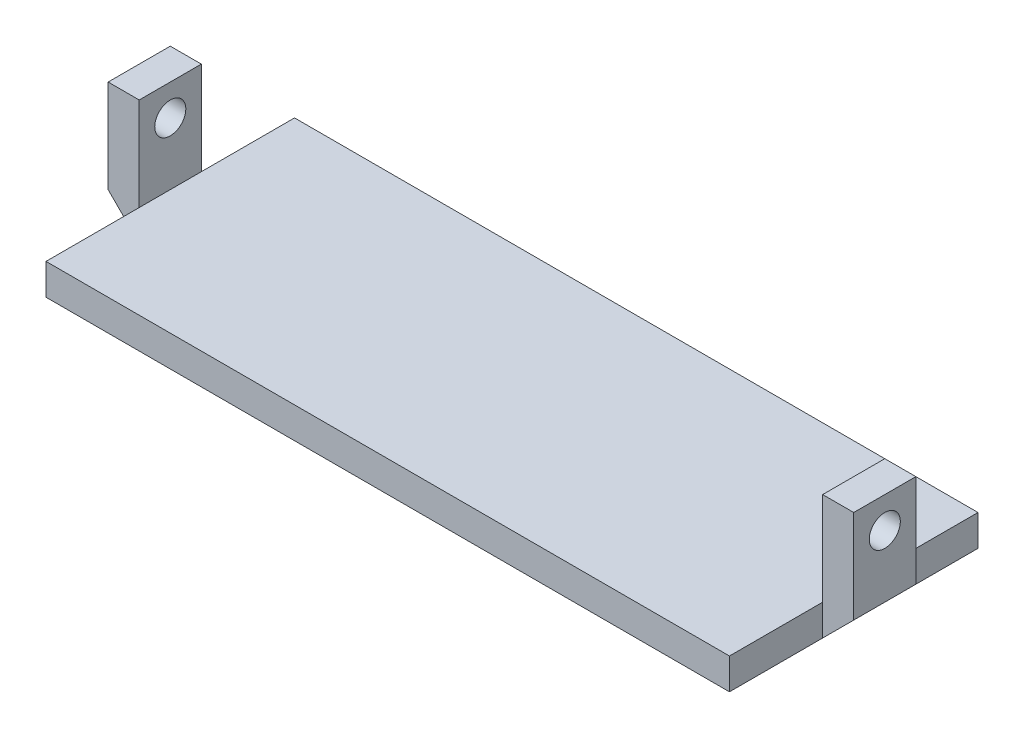
ISO-10303-21;
HEADER;
FILE_DESCRIPTION(('STEP AP214'),'2;1');
FILE_NAME('part.step','',(''),(''),'','','');
FILE_SCHEMA(('AUTOMOTIVE_DESIGN { 1 0 10303 214 1 1 1 1 }'));
ENDSEC;
DATA;
#1=APPLICATION_CONTEXT('core data for automotive mechanical design processes');
#2=APPLICATION_PROTOCOL_DEFINITION('international standard','automotive_design',2000,#1);
#3=PRODUCT_CONTEXT('',#1,'mechanical');
#4=PRODUCT('Part','Part','',(#3));
#5=PRODUCT_RELATED_PRODUCT_CATEGORY('part','',(#4));
#6=PRODUCT_DEFINITION_FORMATION('','',#4);
#7=PRODUCT_DEFINITION_CONTEXT('part definition',#1,'design');
#8=PRODUCT_DEFINITION('design','',#6,#7);
#9=PRODUCT_DEFINITION_SHAPE('','',#8);
#10=(LENGTH_UNIT() NAMED_UNIT(*) SI_UNIT(.MILLI.,.METRE.));
#11=(NAMED_UNIT(*) PLANE_ANGLE_UNIT() SI_UNIT($,.RADIAN.));
#12=(NAMED_UNIT(*) SI_UNIT($,.STERADIAN.) SOLID_ANGLE_UNIT());
#13=UNCERTAINTY_MEASURE_WITH_UNIT(LENGTH_MEASURE(1.E-05),#10,'distance_accuracy_value','');
#14=(GEOMETRIC_REPRESENTATION_CONTEXT(3) GLOBAL_UNCERTAINTY_ASSIGNED_CONTEXT((#13)) GLOBAL_UNIT_ASSIGNED_CONTEXT((#10,
#11,#12)) REPRESENTATION_CONTEXT('',''));
#15=CARTESIAN_POINT('',(0.,0.,0.));
#16=DIRECTION('',(0.,0.,1.));
#17=DIRECTION('',(1.,0.,0.));
#18=AXIS2_PLACEMENT_3D('',#15,#16,#17);
#19=CARTESIAN_POINT('',(0.,5.,0.));
#20=DIRECTION('',(0.,1.,0.));
#21=DIRECTION('',(0.,0.,1.));
#22=AXIS2_PLACEMENT_3D('',#19,#20,#21);
#23=PLANE('',#22);
#24=DIRECTION('',(0.,0.,-1.));
#25=VECTOR('',#24,1.);
#26=CARTESIAN_POINT('',(-55.,5.,17.5));
#27=LINE('',#26,#25);
#28=CARTESIAN_POINT('',(-55.,5.,32.5));
#29=VERTEX_POINT('',#28);
#30=CARTESIAN_POINT('',(-55.,5.,17.5));
#31=VERTEX_POINT('',#30);
#32=EDGE_CURVE('E313',#29,#31,#27,.T.);
#33=ORIENTED_EDGE('',*,*,#32,.F.);
#34=DIRECTION('',(1.,0.,0.));
#35=VECTOR('',#34,1.);
#36=CARTESIAN_POINT('',(0.,5.,32.5));
#37=LINE('',#36,#35);
#38=CARTESIAN_POINT('',(55.,5.,32.5));
#39=VERTEX_POINT('',#38);
#40=EDGE_CURVE('E63',#29,#39,#37,.T.);
#41=ORIENTED_EDGE('',*,*,#40,.T.);
#42=DIRECTION('',(0.,0.,1.));
#43=VECTOR('',#42,1.);
#44=CARTESIAN_POINT('',(55.,5.,17.5));
#45=LINE('',#44,#43);
#46=CARTESIAN_POINT('',(55.,5.,17.5));
#47=VERTEX_POINT('',#46);
#48=EDGE_CURVE('E164',#47,#39,#45,.T.);
#49=ORIENTED_EDGE('',*,*,#48,.F.);
#50=DIRECTION('',(0.,0.,1.));
#51=VECTOR('',#50,1.);
#52=CARTESIAN_POINT('',(55.,5.,7.49999999999998));
#53=LINE('',#52,#51);
#54=CARTESIAN_POINT('',(55.,5.,7.49999999999999));
#55=VERTEX_POINT('',#54);
#56=EDGE_CURVE('E225',#55,#47,#53,.T.);
#57=ORIENTED_EDGE('',*,*,#56,.F.);
#58=DIRECTION('',(0.,0.,1.));
#59=VECTOR('',#58,1.);
#60=CARTESIAN_POINT('',(55.,5.,-7.50000000000001));
#61=LINE('',#60,#59);
#62=CARTESIAN_POINT('',(55.,5.,-7.50000000000001));
#63=VERTEX_POINT('',#62);
#64=EDGE_CURVE('E179',#63,#55,#61,.T.);
#65=ORIENTED_EDGE('',*,*,#64,.F.);
#66=DIRECTION('',(-1.,0.,0.));
#67=VECTOR('',#66,1.);
#68=CARTESIAN_POINT('',(0.,5.,-7.50000000000001));
#69=LINE('',#68,#67);
#70=CARTESIAN_POINT('',(-55.,5.,-7.50000000000001));
#71=VERTEX_POINT('',#70);
#72=EDGE_CURVE('E166',#63,#71,#69,.T.);
#73=ORIENTED_EDGE('',*,*,#72,.T.);
#74=DIRECTION('',(0.,0.,-1.));
#75=VECTOR('',#74,1.);
#76=CARTESIAN_POINT('',(-55.,5.,-7.50000000000001));
#77=LINE('',#76,#75);
#78=CARTESIAN_POINT('',(-55.,5.,7.49999999999999));
#79=VERTEX_POINT('',#78);
#80=EDGE_CURVE('E204',#79,#71,#77,.T.);
#81=ORIENTED_EDGE('',*,*,#80,.F.);
#82=DIRECTION('',(0.,0.,-1.));
#83=VECTOR('',#82,1.);
#84=CARTESIAN_POINT('',(-55.,5.,7.49999999999999));
#85=LINE('',#84,#83);
#86=EDGE_CURVE('E258',#31,#79,#85,.T.);
#87=ORIENTED_EDGE('',*,*,#86,.F.);
#88=EDGE_LOOP('',(#33,#41,#49,#57,#65,#73,#81,#87));
#89=FACE_BOUND('',#88,.T.);
#90=ADVANCED_FACE('F47',(#89),#23,.T.);
#91=CARTESIAN_POINT('',(0.,0.,0.));
#92=DIRECTION('',(0.,1.,0.));
#93=DIRECTION('',(0.,0.,1.));
#94=AXIS2_PLACEMENT_3D('',#91,#92,#93);
#95=PLANE('',#94);
#96=DIRECTION('',(-1.,0.,0.));
#97=VECTOR('',#96,1.);
#98=CARTESIAN_POINT('',(0.,0.,32.5));
#99=LINE('',#98,#97);
#100=CARTESIAN_POINT('',(55.,0.,32.5));
#101=VERTEX_POINT('',#100);
#102=CARTESIAN_POINT('',(-55.,0.,32.5));
#103=VERTEX_POINT('',#102);
#104=EDGE_CURVE('E148',#101,#103,#99,.T.);
#105=ORIENTED_EDGE('',*,*,#104,.T.);
#106=DIRECTION('',(0.,0.,-1.));
#107=VECTOR('',#106,1.);
#108=CARTESIAN_POINT('',(-55.,0.,17.5));
#109=LINE('',#108,#107);
#110=CARTESIAN_POINT('',(-55.,0.,17.5));
#111=VERTEX_POINT('',#110);
#112=EDGE_CURVE('E316',#103,#111,#109,.T.);
#113=ORIENTED_EDGE('',*,*,#112,.T.);
#114=DIRECTION('',(0.,0.,-1.));
#115=VECTOR('',#114,1.);
#116=CARTESIAN_POINT('',(-55.,0.,0.));
#117=LINE('',#116,#115);
#118=CARTESIAN_POINT('',(-55.,0.,7.49999999999999));
#119=VERTEX_POINT('',#118);
#120=EDGE_CURVE('E287',#111,#119,#117,.T.);
#121=ORIENTED_EDGE('',*,*,#120,.T.);
#122=DIRECTION('',(0.,0.,-1.));
#123=VECTOR('',#122,1.);
#124=CARTESIAN_POINT('',(-55.,0.,-7.50000000000001));
#125=LINE('',#124,#123);
#126=CARTESIAN_POINT('',(-55.,0.,-7.50000000000001));
#127=VERTEX_POINT('',#126);
#128=EDGE_CURVE('E303',#119,#127,#125,.T.);
#129=ORIENTED_EDGE('',*,*,#128,.T.);
#130=DIRECTION('',(1.,0.,0.));
#131=VECTOR('',#130,1.);
#132=CARTESIAN_POINT('',(0.,0.,-7.50000000000001));
#133=LINE('',#132,#131);
#134=CARTESIAN_POINT('',(55.,0.,-7.50000000000001));
#135=VERTEX_POINT('',#134);
#136=EDGE_CURVE('E156',#127,#135,#133,.T.);
#137=ORIENTED_EDGE('',*,*,#136,.T.);
#138=DIRECTION('',(0.,0.,1.));
#139=VECTOR('',#138,1.);
#140=CARTESIAN_POINT('',(55.,0.,-7.50000000000001));
#141=LINE('',#140,#139);
#142=CARTESIAN_POINT('',(55.,0.,7.49999999999999));
#143=VERTEX_POINT('',#142);
#144=EDGE_CURVE('E186',#135,#143,#141,.T.);
#145=ORIENTED_EDGE('',*,*,#144,.T.);
#146=DIRECTION('',(0.,0.,1.));
#147=VECTOR('',#146,1.);
#148=CARTESIAN_POINT('',(55.,0.,0.));
#149=LINE('',#148,#147);
#150=CARTESIAN_POINT('',(55.,0.,17.5));
#151=VERTEX_POINT('',#150);
#152=EDGE_CURVE('E171',#143,#151,#149,.T.);
#153=ORIENTED_EDGE('',*,*,#152,.T.);
#154=DIRECTION('',(0.,0.,1.));
#155=VECTOR('',#154,1.);
#156=CARTESIAN_POINT('',(55.,0.,17.5));
#157=LINE('',#156,#155);
#158=EDGE_CURVE('E162',#151,#101,#157,.T.);
#159=ORIENTED_EDGE('',*,*,#158,.T.);
#160=EDGE_LOOP('',(#105,#113,#121,#129,#137,#145,#153,#159));
#161=FACE_BOUND('',#160,.T.);
#162=ADVANCED_FACE('F168',(#161),#95,.F.);
#163=CARTESIAN_POINT('',(55.,0.,17.5));
#164=DIRECTION('',(-1.,0.,0.));
#165=DIRECTION('',(0.,0.,1.));
#166=AXIS2_PLACEMENT_3D('',#163,#164,#165);
#167=PLANE('',#166);
#168=DIRECTION('',(0.,-1.,0.));
#169=VECTOR('',#168,1.);
#170=CARTESIAN_POINT('',(55.,20.,32.5));
#171=LINE('',#170,#169);
#172=EDGE_CURVE('E151',#39,#101,#171,.T.);
#173=ORIENTED_EDGE('',*,*,#172,.T.);
#174=ORIENTED_EDGE('',*,*,#158,.F.);
#175=DIRECTION('',(0.,1.,0.));
#176=VECTOR('',#175,1.);
#177=CARTESIAN_POINT('',(55.,0.,17.5));
#178=LINE('',#177,#176);
#179=EDGE_CURVE('E173',#151,#47,#178,.T.);
#180=ORIENTED_EDGE('',*,*,#179,.T.);
#181=ORIENTED_EDGE('',*,*,#48,.T.);
#182=EDGE_LOOP('',(#173,#174,#180,#181));
#183=FACE_BOUND('',#182,.T.);
#184=ADVANCED_FACE('F161',(#183),#167,.F.);
#185=CARTESIAN_POINT('',(-55.,0.,17.5));
#186=DIRECTION('',(1.,0.,0.));
#187=DIRECTION('',(0.,0.,-1.));
#188=AXIS2_PLACEMENT_3D('',#185,#186,#187);
#189=PLANE('',#188);
#190=DIRECTION('',(0.,-1.,0.));
#191=VECTOR('',#190,1.);
#192=CARTESIAN_POINT('',(-55.,0.,32.5));
#193=LINE('',#192,#191);
#194=EDGE_CURVE('E11',#29,#103,#193,.T.);
#195=ORIENTED_EDGE('',*,*,#194,.F.);
#196=ORIENTED_EDGE('',*,*,#32,.T.);
#197=DIRECTION('',(0.,1.,0.));
#198=VECTOR('',#197,1.);
#199=CARTESIAN_POINT('',(-55.,0.,17.5));
#200=LINE('',#199,#198);
#201=EDGE_CURVE('E177',#111,#31,#200,.T.);
#202=ORIENTED_EDGE('',*,*,#201,.F.);
#203=ORIENTED_EDGE('',*,*,#112,.F.);
#204=EDGE_LOOP('',(#195,#196,#202,#203));
#205=FACE_BOUND('',#204,.T.);
#206=ADVANCED_FACE('F364',(#205),#189,.F.);
#207=CARTESIAN_POINT('',(60.,5.,-42.5));
#208=DIRECTION('',(-1.,0.,0.));
#209=DIRECTION('',(0.,0.,1.));
#210=AXIS2_PLACEMENT_3D('',#207,#208,#209);
#211=PLANE('',#210);
#212=CARTESIAN_POINT('',(60.,15.,12.5));
#213=DIRECTION('',(-1.,0.,0.));
#214=DIRECTION('',(0.,0.,1.));
#215=AXIS2_PLACEMENT_3D('',#212,#213,#214);
#216=CIRCLE('',#215,2.5);
#217=CARTESIAN_POINT('',(60.,15.,15.));
#218=VERTEX_POINT('',#217);
#219=EDGE_CURVE('E200',#218,#218,#216,.T.);
#220=ORIENTED_EDGE('',*,*,#219,.T.);
#221=EDGE_LOOP('',(#220));
#222=FACE_BOUND('',#221,.T.);
#223=DIRECTION('',(0.,-1.,0.));
#224=VECTOR('',#223,1.);
#225=CARTESIAN_POINT('',(60.,20.,17.5));
#226=LINE('',#225,#224);
#227=CARTESIAN_POINT('',(60.,20.,17.5));
#228=VERTEX_POINT('',#227);
#229=CARTESIAN_POINT('',(60.,5.,17.5));
#230=VERTEX_POINT('',#229);
#231=EDGE_CURVE('E217',#228,#230,#226,.T.);
#232=ORIENTED_EDGE('',*,*,#231,.T.);
#233=DIRECTION('',(0.,0.,-1.));
#234=VECTOR('',#233,1.);
#235=CARTESIAN_POINT('',(60.,5.,-42.5));
#236=LINE('',#235,#234);
#237=CARTESIAN_POINT('',(60.,5.,7.49999999999997));
#238=VERTEX_POINT('',#237);
#239=EDGE_CURVE('E293',#230,#238,#236,.T.);
#240=ORIENTED_EDGE('',*,*,#239,.T.);
#241=DIRECTION('',(0.,-1.,0.));
#242=VECTOR('',#241,1.);
#243=CARTESIAN_POINT('',(60.,20.,7.49999999999997));
#244=LINE('',#243,#242);
#245=CARTESIAN_POINT('',(60.,20.,7.49999999999997));
#246=VERTEX_POINT('',#245);
#247=EDGE_CURVE('E220',#246,#238,#244,.T.);
#248=ORIENTED_EDGE('',*,*,#247,.F.);
#249=DIRECTION('',(0.,0.,-1.));
#250=VECTOR('',#249,1.);
#251=CARTESIAN_POINT('',(60.,20.,7.49999999999997));
#252=LINE('',#251,#250);
#253=EDGE_CURVE('E224',#228,#246,#252,.T.);
#254=ORIENTED_EDGE('',*,*,#253,.F.);
#255=EDGE_LOOP('',(#232,#240,#248,#254));
#256=FACE_BOUND('',#255,.T.);
#257=ADVANCED_FACE('F350',(#222,#256),#211,.F.);
#258=CARTESIAN_POINT('',(-60.,5.,-42.5));
#259=DIRECTION('',(1.,0.,0.));
#260=DIRECTION('',(0.,0.,-1.));
#261=AXIS2_PLACEMENT_3D('',#258,#259,#260);
#262=PLANE('',#261);
#263=CARTESIAN_POINT('',(-60.,15.,12.5));
#264=DIRECTION('',(-1.,0.,0.));
#265=DIRECTION('',(0.,0.,1.));
#266=AXIS2_PLACEMENT_3D('',#263,#264,#265);
#267=CIRCLE('',#266,2.5);
#268=CARTESIAN_POINT('',(-60.,15.,15.));
#269=VERTEX_POINT('',#268);
#270=EDGE_CURVE('E195',#269,#269,#267,.T.);
#271=ORIENTED_EDGE('',*,*,#270,.F.);
#272=EDGE_LOOP('',(#271));
#273=FACE_BOUND('',#272,.T.);
#274=DIRECTION('',(0.,-1.,0.));
#275=VECTOR('',#274,1.);
#276=CARTESIAN_POINT('',(-60.,20.,7.49999999999999));
#277=LINE('',#276,#275);
#278=CARTESIAN_POINT('',(-60.,20.,7.49999999999999));
#279=VERTEX_POINT('',#278);
#280=CARTESIAN_POINT('',(-60.,4.99999999999999,7.49999999999999));
#281=VERTEX_POINT('',#280);
#282=EDGE_CURVE('E253',#279,#281,#277,.T.);
#283=ORIENTED_EDGE('',*,*,#282,.T.);
#284=DIRECTION('',(0.,0.,1.));
#285=VECTOR('',#284,1.);
#286=CARTESIAN_POINT('',(-60.,4.99999999999999,-42.5));
#287=LINE('',#286,#285);
#288=CARTESIAN_POINT('',(-60.,4.99999999999999,17.5));
#289=VERTEX_POINT('',#288);
#290=EDGE_CURVE('E262',#281,#289,#287,.T.);
#291=ORIENTED_EDGE('',*,*,#290,.T.);
#292=DIRECTION('',(0.,-1.,0.));
#293=VECTOR('',#292,1.);
#294=CARTESIAN_POINT('',(-60.,20.,17.5));
#295=LINE('',#294,#293);
#296=CARTESIAN_POINT('',(-60.,20.,17.5));
#297=VERTEX_POINT('',#296);
#298=EDGE_CURVE('E229',#297,#289,#295,.T.);
#299=ORIENTED_EDGE('',*,*,#298,.F.);
#300=DIRECTION('',(0.,0.,1.));
#301=VECTOR('',#300,1.);
#302=CARTESIAN_POINT('',(-60.,20.,7.49999999999999));
#303=LINE('',#302,#301);
#304=EDGE_CURVE('E263',#279,#297,#303,.T.);
#305=ORIENTED_EDGE('',*,*,#304,.F.);
#306=EDGE_LOOP('',(#283,#291,#299,#305));
#307=FACE_BOUND('',#306,.T.);
#308=ADVANCED_FACE('F374',(#273,#307),#262,.F.);
#309=CARTESIAN_POINT('',(-60.,20.,17.5));
#310=DIRECTION('',(0.,0.,-1.));
#311=DIRECTION('',(-1.,0.,0.));
#312=AXIS2_PLACEMENT_3D('',#309,#310,#311);
#313=PLANE('',#312);
#314=ORIENTED_EDGE('',*,*,#298,.T.);
#315=DIRECTION('',(-0.707106781186549,0.707106781186547,0.));
#316=VECTOR('',#315,1.);
#317=CARTESIAN_POINT('',(-60.,5.,17.5));
#318=LINE('',#317,#316);
#319=EDGE_CURVE('E281',#289,#111,#318,.F.);
#320=ORIENTED_EDGE('',*,*,#319,.T.);
#321=ORIENTED_EDGE('',*,*,#201,.T.);
#322=DIRECTION('',(0.,-1.,0.));
#323=VECTOR('',#322,1.);
#324=CARTESIAN_POINT('',(-55.,20.,17.5));
#325=LINE('',#324,#323);
#326=CARTESIAN_POINT('',(-55.,20.,17.5));
#327=VERTEX_POINT('',#326);
#328=EDGE_CURVE('E245',#327,#31,#325,.T.);
#329=ORIENTED_EDGE('',*,*,#328,.F.);
#330=DIRECTION('',(1.,0.,0.));
#331=VECTOR('',#330,1.);
#332=CARTESIAN_POINT('',(-60.,20.,17.5));
#333=LINE('',#332,#331);
#334=EDGE_CURVE('E269',#297,#327,#333,.T.);
#335=ORIENTED_EDGE('',*,*,#334,.F.);
#336=EDGE_LOOP('',(#314,#320,#321,#329,#335));
#337=FACE_BOUND('',#336,.T.);
#338=ADVANCED_FACE('F367',(#337),#313,.F.);
#339=CARTESIAN_POINT('',(-55.,20.,7.49999999999999));
#340=DIRECTION('',(-1.,0.,0.));
#341=DIRECTION('',(0.,0.,1.));
#342=AXIS2_PLACEMENT_3D('',#339,#340,#341);
#343=PLANE('',#342);
#344=CARTESIAN_POINT('',(-55.,15.,12.5));
#345=DIRECTION('',(-1.,0.,0.));
#346=DIRECTION('',(0.,0.,1.));
#347=AXIS2_PLACEMENT_3D('',#344,#345,#346);
#348=CIRCLE('',#347,2.5);
#349=CARTESIAN_POINT('',(-55.,15.,15.));
#350=VERTEX_POINT('',#349);
#351=EDGE_CURVE('E205',#350,#350,#348,.T.);
#352=ORIENTED_EDGE('',*,*,#351,.T.);
#353=EDGE_LOOP('',(#352));
#354=FACE_BOUND('',#353,.T.);
#355=ORIENTED_EDGE('',*,*,#86,.T.);
#356=DIRECTION('',(0.,-1.,0.));
#357=VECTOR('',#356,1.);
#358=CARTESIAN_POINT('',(-55.,20.,7.49999999999999));
#359=LINE('',#358,#357);
#360=CARTESIAN_POINT('',(-55.,20.,7.49999999999999));
#361=VERTEX_POINT('',#360);
#362=EDGE_CURVE('E249',#361,#79,#359,.T.);
#363=ORIENTED_EDGE('',*,*,#362,.F.);
#364=DIRECTION('',(0.,0.,-1.));
#365=VECTOR('',#364,1.);
#366=CARTESIAN_POINT('',(-55.,20.,7.49999999999999));
#367=LINE('',#366,#365);
#368=EDGE_CURVE('E266',#327,#361,#367,.T.);
#369=ORIENTED_EDGE('',*,*,#368,.F.);
#370=ORIENTED_EDGE('',*,*,#328,.T.);
#371=EDGE_LOOP('',(#355,#363,#369,#370));
#372=FACE_BOUND('',#371,.T.);
#373=ADVANCED_FACE('F439',(#354,#372),#343,.F.);
#374=CARTESIAN_POINT('',(-60.,20.,7.49999999999999));
#375=DIRECTION('',(0.,0.,1.));
#376=DIRECTION('',(1.,0.,0.));
#377=AXIS2_PLACEMENT_3D('',#374,#375,#376);
#378=PLANE('',#377);
#379=DIRECTION('',(0.,1.,0.));
#380=VECTOR('',#379,1.);
#381=CARTESIAN_POINT('',(-55.,0.,7.49999999999999));
#382=LINE('',#381,#380);
#383=EDGE_CURVE('E307',#119,#79,#382,.T.);
#384=ORIENTED_EDGE('',*,*,#383,.F.);
#385=DIRECTION('',(0.707106781186549,-0.707106781186547,0.));
#386=VECTOR('',#385,1.);
#387=CARTESIAN_POINT('',(-60.,4.99999999999999,7.49999999999999));
#388=LINE('',#387,#386);
#389=EDGE_CURVE('E290',#119,#281,#388,.F.);
#390=ORIENTED_EDGE('',*,*,#389,.T.);
#391=ORIENTED_EDGE('',*,*,#282,.F.);
#392=DIRECTION('',(-1.,0.,0.));
#393=VECTOR('',#392,1.);
#394=CARTESIAN_POINT('',(-60.,20.,7.49999999999999));
#395=LINE('',#394,#393);
#396=EDGE_CURVE('E257',#361,#279,#395,.T.);
#397=ORIENTED_EDGE('',*,*,#396,.F.);
#398=ORIENTED_EDGE('',*,*,#362,.T.);
#399=EDGE_LOOP('',(#384,#390,#391,#397,#398));
#400=FACE_BOUND('',#399,.T.);
#401=ADVANCED_FACE('F379',(#400),#378,.F.);
#402=CARTESIAN_POINT('',(0.,20.,0.));
#403=DIRECTION('',(0.,1.,0.));
#404=DIRECTION('',(0.,0.,1.));
#405=AXIS2_PLACEMENT_3D('',#402,#403,#404);
#406=PLANE('',#405);
#407=ORIENTED_EDGE('',*,*,#304,.T.);
#408=ORIENTED_EDGE('',*,*,#334,.T.);
#409=ORIENTED_EDGE('',*,*,#368,.T.);
#410=ORIENTED_EDGE('',*,*,#396,.T.);
#411=EDGE_LOOP('',(#407,#408,#409,#410));
#412=FACE_BOUND('',#411,.T.);
#413=ADVANCED_FACE('F399',(#412),#406,.T.);
#414=CARTESIAN_POINT('',(60.,20.,7.49999999999997));
#415=DIRECTION('',(0.,0.,1.));
#416=DIRECTION('',(1.,0.,0.));
#417=AXIS2_PLACEMENT_3D('',#414,#415,#416);
#418=PLANE('',#417);
#419=ORIENTED_EDGE('',*,*,#247,.T.);
#420=DIRECTION('',(0.707106781186549,0.707106781186546,0.));
#421=VECTOR('',#420,1.);
#422=CARTESIAN_POINT('',(60.,5.,7.49999999999997));
#423=LINE('',#422,#421);
#424=EDGE_CURVE('E297',#238,#143,#423,.F.);
#425=ORIENTED_EDGE('',*,*,#424,.T.);
#426=DIRECTION('',(0.,1.,0.));
#427=VECTOR('',#426,1.);
#428=CARTESIAN_POINT('',(55.,0.,7.49999999999999));
#429=LINE('',#428,#427);
#430=EDGE_CURVE('E187',#143,#55,#429,.T.);
#431=ORIENTED_EDGE('',*,*,#430,.T.);
#432=DIRECTION('',(0.,-1.,0.));
#433=VECTOR('',#432,1.);
#434=CARTESIAN_POINT('',(55.,20.,7.49999999999998));
#435=LINE('',#434,#433);
#436=CARTESIAN_POINT('',(55.,20.,7.49999999999998));
#437=VERTEX_POINT('',#436);
#438=EDGE_CURVE('E209',#437,#55,#435,.T.);
#439=ORIENTED_EDGE('',*,*,#438,.F.);
#440=DIRECTION('',(-1.,0.,0.));
#441=VECTOR('',#440,1.);
#442=CARTESIAN_POINT('',(60.,20.,7.49999999999997));
#443=LINE('',#442,#441);
#444=EDGE_CURVE('E230',#246,#437,#443,.T.);
#445=ORIENTED_EDGE('',*,*,#444,.F.);
#446=EDGE_LOOP('',(#419,#425,#431,#439,#445));
#447=FACE_BOUND('',#446,.T.);
#448=ADVANCED_FACE('F344',(#447),#418,.F.);
#449=CARTESIAN_POINT('',(55.,20.,7.49999999999998));
#450=DIRECTION('',(1.,0.,0.));
#451=DIRECTION('',(0.,0.,-1.));
#452=AXIS2_PLACEMENT_3D('',#449,#450,#451);
#453=PLANE('',#452);
#454=CARTESIAN_POINT('',(55.,15.,12.5));
#455=DIRECTION('',(1.,0.,0.));
#456=DIRECTION('',(0.,0.,-1.));
#457=AXIS2_PLACEMENT_3D('',#454,#455,#456);
#458=CIRCLE('',#457,2.5);
#459=CARTESIAN_POINT('',(55.,15.,15.));
#460=VERTEX_POINT('',#459);
#461=EDGE_CURVE('E199',#460,#460,#458,.T.);
#462=ORIENTED_EDGE('',*,*,#461,.T.);
#463=EDGE_LOOP('',(#462));
#464=FACE_BOUND('',#463,.T.);
#465=ORIENTED_EDGE('',*,*,#56,.T.);
#466=DIRECTION('',(0.,-1.,0.));
#467=VECTOR('',#466,1.);
#468=CARTESIAN_POINT('',(55.,20.,17.5));
#469=LINE('',#468,#467);
#470=CARTESIAN_POINT('',(55.,20.,17.5));
#471=VERTEX_POINT('',#470);
#472=EDGE_CURVE('E213',#471,#47,#469,.T.);
#473=ORIENTED_EDGE('',*,*,#472,.F.);
#474=DIRECTION('',(0.,0.,1.));
#475=VECTOR('',#474,1.);
#476=CARTESIAN_POINT('',(55.,20.,7.49999999999998));
#477=LINE('',#476,#475);
#478=EDGE_CURVE('E236',#437,#471,#477,.T.);
#479=ORIENTED_EDGE('',*,*,#478,.F.);
#480=ORIENTED_EDGE('',*,*,#438,.T.);
#481=EDGE_LOOP('',(#465,#473,#479,#480));
#482=FACE_BOUND('',#481,.T.);
#483=ADVANCED_FACE('F358',(#464,#482),#453,.F.);
#484=CARTESIAN_POINT('',(60.,20.,17.5));
#485=DIRECTION('',(0.,0.,-1.));
#486=DIRECTION('',(-1.,0.,0.));
#487=AXIS2_PLACEMENT_3D('',#484,#485,#486);
#488=PLANE('',#487);
#489=ORIENTED_EDGE('',*,*,#179,.F.);
#490=DIRECTION('',(-0.707106781186549,-0.707106781186546,0.));
#491=VECTOR('',#490,1.);
#492=CARTESIAN_POINT('',(60.,5.,17.5));
#493=LINE('',#492,#491);
#494=EDGE_CURVE('E57',#151,#230,#493,.F.);
#495=ORIENTED_EDGE('',*,*,#494,.T.);
#496=ORIENTED_EDGE('',*,*,#231,.F.);
#497=DIRECTION('',(1.,0.,0.));
#498=VECTOR('',#497,1.);
#499=CARTESIAN_POINT('',(60.,20.,17.5));
#500=LINE('',#499,#498);
#501=EDGE_CURVE('E233',#471,#228,#500,.T.);
#502=ORIENTED_EDGE('',*,*,#501,.F.);
#503=ORIENTED_EDGE('',*,*,#472,.T.);
#504=EDGE_LOOP('',(#489,#495,#496,#502,#503));
#505=FACE_BOUND('',#504,.T.);
#506=ADVANCED_FACE('F353',(#505),#488,.F.);
#507=CARTESIAN_POINT('',(0.,20.,0.));
#508=DIRECTION('',(0.,1.,0.));
#509=DIRECTION('',(0.,0.,1.));
#510=AXIS2_PLACEMENT_3D('',#507,#508,#509);
#511=PLANE('',#510);
#512=ORIENTED_EDGE('',*,*,#444,.T.);
#513=ORIENTED_EDGE('',*,*,#478,.T.);
#514=ORIENTED_EDGE('',*,*,#501,.T.);
#515=ORIENTED_EDGE('',*,*,#253,.T.);
#516=EDGE_LOOP('',(#512,#513,#514,#515));
#517=FACE_BOUND('',#516,.T.);
#518=ADVANCED_FACE('F356',(#517),#511,.T.);
#519=CARTESIAN_POINT('',(60.,15.,12.5));
#520=DIRECTION('',(-1.,0.,0.));
#521=DIRECTION('',(0.,0.,1.));
#522=AXIS2_PLACEMENT_3D('',#519,#520,#521);
#523=CYLINDRICAL_SURFACE('',#522,2.5);
#524=CARTESIAN_POINT('',(60.,15.,15.));
#525=CARTESIAN_POINT('',(59.9479166666667,15.,15.));
#526=CARTESIAN_POINT('',(59.8958333333334,15.,15.));
#527=CARTESIAN_POINT('',(59.7916666666667,15.,15.));
#528=CARTESIAN_POINT('',(59.7395833333333,15.,15.));
#529=CARTESIAN_POINT('',(59.6354166666667,15.,15.));
#530=CARTESIAN_POINT('',(59.5833333333334,15.,15.));
#531=CARTESIAN_POINT('',(59.4791666666667,15.,15.));
#532=CARTESIAN_POINT('',(59.4270833333333,15.,15.));
#533=CARTESIAN_POINT('',(59.3229166666667,15.,15.));
#534=CARTESIAN_POINT('',(59.2708333333334,15.,15.));
#535=CARTESIAN_POINT('',(59.1666666666667,15.,15.));
#536=CARTESIAN_POINT('',(59.1145833333333,15.,15.));
#537=CARTESIAN_POINT('',(59.0104166666667,15.,15.));
#538=CARTESIAN_POINT('',(58.9583333333333,15.,15.));
#539=CARTESIAN_POINT('',(58.8541666666667,15.,15.));
#540=CARTESIAN_POINT('',(58.8020833333333,15.,15.));
#541=CARTESIAN_POINT('',(58.6979166666667,15.,15.));
#542=CARTESIAN_POINT('',(58.6458333333333,15.,15.));
#543=CARTESIAN_POINT('',(58.5416666666667,15.,15.));
#544=CARTESIAN_POINT('',(58.4895833333333,15.,15.));
#545=CARTESIAN_POINT('',(58.3854166666667,15.,15.));
#546=CARTESIAN_POINT('',(58.3333333333333,15.,15.));
#547=CARTESIAN_POINT('',(58.2291666666667,15.,15.));
#548=CARTESIAN_POINT('',(58.1770833333333,15.,15.));
#549=CARTESIAN_POINT('',(58.0729166666667,15.,15.));
#550=CARTESIAN_POINT('',(58.0208333333333,15.,15.));
#551=CARTESIAN_POINT('',(57.9166666666667,15.,15.));
#552=CARTESIAN_POINT('',(57.8645833333333,15.,15.));
#553=CARTESIAN_POINT('',(57.7604166666667,15.,15.));
#554=CARTESIAN_POINT('',(57.7083333333333,15.,15.));
#555=CARTESIAN_POINT('',(57.6041666666667,15.,15.));
#556=CARTESIAN_POINT('',(57.5520833333333,15.,15.));
#557=CARTESIAN_POINT('',(57.4479166666667,15.,15.));
#558=CARTESIAN_POINT('',(57.3958333333333,15.,15.));
#559=CARTESIAN_POINT('',(57.2916666666667,15.,15.));
#560=CARTESIAN_POINT('',(57.2395833333333,15.,15.));
#561=CARTESIAN_POINT('',(57.1354166666667,15.,15.));
#562=CARTESIAN_POINT('',(57.0833333333333,15.,15.));
#563=CARTESIAN_POINT('',(56.9791666666667,15.,15.));
#564=CARTESIAN_POINT('',(56.9270833333333,15.,15.));
#565=CARTESIAN_POINT('',(56.8229166666667,15.,15.));
#566=CARTESIAN_POINT('',(56.7708333333333,15.,15.));
#567=CARTESIAN_POINT('',(56.6666666666667,15.,15.));
#568=CARTESIAN_POINT('',(56.6145833333333,15.,15.));
#569=CARTESIAN_POINT('',(56.5104166666667,15.,15.));
#570=CARTESIAN_POINT('',(56.4583333333333,15.,15.));
#571=CARTESIAN_POINT('',(56.3541666666667,15.,15.));
#572=CARTESIAN_POINT('',(56.3020833333333,15.,15.));
#573=CARTESIAN_POINT('',(56.1979166666667,15.,15.));
#574=CARTESIAN_POINT('',(56.1458333333333,15.,15.));
#575=CARTESIAN_POINT('',(56.0416666666667,15.,15.));
#576=CARTESIAN_POINT('',(55.9895833333333,15.,15.));
#577=CARTESIAN_POINT('',(55.8854166666667,15.,15.));
#578=CARTESIAN_POINT('',(55.8333333333333,15.,15.));
#579=CARTESIAN_POINT('',(55.7291666666667,15.,15.));
#580=CARTESIAN_POINT('',(55.6770833333333,15.,15.));
#581=CARTESIAN_POINT('',(55.5729166666667,15.,15.));
#582=CARTESIAN_POINT('',(55.5208333333333,15.,15.));
#583=CARTESIAN_POINT('',(55.4166666666667,15.,15.));
#584=CARTESIAN_POINT('',(55.3645833333333,15.,15.));
#585=CARTESIAN_POINT('',(55.2604166666667,15.,15.));
#586=CARTESIAN_POINT('',(55.2083333333333,15.,15.));
#587=CARTESIAN_POINT('',(55.1041666666667,15.,15.));
#588=CARTESIAN_POINT('',(55.0520833333333,15.,15.));
#589=CARTESIAN_POINT('',(55.,15.,15.));
#590=B_SPLINE_CURVE_WITH_KNOTS('',3,(#524,#525,#526,#527,#528,#529,#530,#531,#532,#533,#534,
#535,#536,#537,#538,#539,#540,#541,#542,#543,#544,#545,#546,#547,#548,#549,#550,#551,#552,#553,
#554,#555,#556,#557,#558,#559,#560,#561,#562,#563,#564,#565,#566,#567,#568,#569,#570,#571,#572,
#573,#574,#575,#576,#577,#578,#579,#580,#581,#582,#583,#584,#585,#586,#587,#588,#589),
.UNSPECIFIED.,.F.,.F.,(4,2,2,2,2,2,2,2,2,2,2,2,2,2,2,2,2,2,2,2,2,2,2,2,2,2,2,2,2,2,2,2,4),(0.,
0.156250000000004,0.312500000000007,0.468750000000004,0.625000000000008,0.781250000000004,
0.937500000000008,1.09375000000001,1.25000000000001,1.40625000000001,1.56250000000001,
1.71875000000001,1.87500000000002,2.03125000000001,2.18750000000002,2.34375000000001,
2.50000000000002,2.65625000000002,2.81250000000002,2.96875000000002,3.12500000000002,
3.28125000000002,3.43750000000002,3.59375000000002,3.75000000000002,3.90625000000002,
4.06250000000002,4.21875000000002,4.37500000000002,4.53125000000003,4.68750000000002,
4.84375000000003,5.00000000000002),.UNSPECIFIED.);
#591=EDGE_CURVE('BSEAM427',#218,#460,#590,.T.);
#592=ORIENTED_EDGE('',*,*,#219,.F.);
#593=ORIENTED_EDGE('',*,*,#461,.F.);
#594=ORIENTED_EDGE('',*,*,#591,.T.);
#595=ORIENTED_EDGE('',*,*,#591,.F.);
#596=EDGE_LOOP('',(#592,#594,#593,#595));
#597=FACE_BOUND('',#596,.T.);
#598=ADVANCED_FACE('F427',(#597),#523,.F.);
#599=CARTESIAN_POINT('',(-60.,15.,15.));
#600=CARTESIAN_POINT('',(-59.9479166666667,15.,15.));
#601=CARTESIAN_POINT('',(-59.8958333333333,15.,15.));
#602=CARTESIAN_POINT('',(-59.7916666666667,15.,15.));
#603=CARTESIAN_POINT('',(-59.7395833333333,15.,15.));
#604=CARTESIAN_POINT('',(-59.6354166666667,15.,15.));
#605=CARTESIAN_POINT('',(-59.5833333333333,15.,15.));
#606=CARTESIAN_POINT('',(-59.4791666666667,15.,15.));
#607=CARTESIAN_POINT('',(-59.4270833333333,15.,15.));
#608=CARTESIAN_POINT('',(-59.3229166666667,15.,15.));
#609=CARTESIAN_POINT('',(-59.2708333333333,15.,15.));
#610=CARTESIAN_POINT('',(-59.1666666666667,15.,15.));
#611=CARTESIAN_POINT('',(-59.1145833333333,15.,15.));
#612=CARTESIAN_POINT('',(-59.0104166666667,15.,15.));
#613=CARTESIAN_POINT('',(-58.9583333333333,15.,15.));
#614=CARTESIAN_POINT('',(-58.8541666666667,15.,15.));
#615=CARTESIAN_POINT('',(-58.8020833333333,15.,15.));
#616=CARTESIAN_POINT('',(-58.6979166666667,15.,15.));
#617=CARTESIAN_POINT('',(-58.6458333333333,15.,15.));
#618=CARTESIAN_POINT('',(-58.5416666666667,15.,15.));
#619=CARTESIAN_POINT('',(-58.4895833333333,15.,15.));
#620=CARTESIAN_POINT('',(-58.3854166666667,15.,15.));
#621=CARTESIAN_POINT('',(-58.3333333333333,15.,15.));
#622=CARTESIAN_POINT('',(-58.2291666666667,15.,15.));
#623=CARTESIAN_POINT('',(-58.1770833333333,15.,15.));
#624=CARTESIAN_POINT('',(-58.0729166666667,15.,15.));
#625=CARTESIAN_POINT('',(-58.0208333333333,15.,15.));
#626=CARTESIAN_POINT('',(-57.9166666666667,15.,15.));
#627=CARTESIAN_POINT('',(-57.8645833333333,15.,15.));
#628=CARTESIAN_POINT('',(-57.7604166666667,15.,15.));
#629=CARTESIAN_POINT('',(-57.7083333333333,15.,15.));
#630=CARTESIAN_POINT('',(-57.6041666666667,15.,15.));
#631=CARTESIAN_POINT('',(-57.5520833333333,15.,15.));
#632=CARTESIAN_POINT('',(-57.4479166666667,15.,15.));
#633=CARTESIAN_POINT('',(-57.3958333333333,15.,15.));
#634=CARTESIAN_POINT('',(-57.2916666666667,15.,15.));
#635=CARTESIAN_POINT('',(-57.2395833333333,15.,15.));
#636=CARTESIAN_POINT('',(-57.1354166666667,15.,15.));
#637=CARTESIAN_POINT('',(-57.0833333333333,15.,15.));
#638=CARTESIAN_POINT('',(-56.9791666666667,15.,15.));
#639=CARTESIAN_POINT('',(-56.9270833333333,15.,15.));
#640=CARTESIAN_POINT('',(-56.8229166666667,15.,15.));
#641=CARTESIAN_POINT('',(-56.7708333333333,15.,15.));
#642=CARTESIAN_POINT('',(-56.6666666666667,15.,15.));
#643=CARTESIAN_POINT('',(-56.6145833333333,15.,15.));
#644=CARTESIAN_POINT('',(-56.5104166666666,15.,15.));
#645=CARTESIAN_POINT('',(-56.4583333333333,15.,15.));
#646=CARTESIAN_POINT('',(-56.3541666666667,15.,15.));
#647=CARTESIAN_POINT('',(-56.3020833333333,15.,15.));
#648=CARTESIAN_POINT('',(-56.1979166666667,15.,15.));
#649=CARTESIAN_POINT('',(-56.1458333333333,15.,15.));
#650=CARTESIAN_POINT('',(-56.0416666666667,15.,15.));
#651=CARTESIAN_POINT('',(-55.9895833333333,15.,15.));
#652=CARTESIAN_POINT('',(-55.8854166666667,15.,15.));
#653=CARTESIAN_POINT('',(-55.8333333333333,15.,15.));
#654=CARTESIAN_POINT('',(-55.7291666666667,15.,15.));
#655=CARTESIAN_POINT('',(-55.6770833333333,15.,15.));
#656=CARTESIAN_POINT('',(-55.5729166666667,15.,15.));
#657=CARTESIAN_POINT('',(-55.5208333333333,15.,15.));
#658=CARTESIAN_POINT('',(-55.4166666666667,15.,15.));
#659=CARTESIAN_POINT('',(-55.3645833333333,15.,15.));
#660=CARTESIAN_POINT('',(-55.2604166666666,15.,15.));
#661=CARTESIAN_POINT('',(-55.2083333333333,15.,15.));
#662=CARTESIAN_POINT('',(-55.1041666666667,15.,15.));
#663=CARTESIAN_POINT('',(-55.0520833333333,15.,15.));
#664=CARTESIAN_POINT('',(-55.,15.,15.));
#665=B_SPLINE_CURVE_WITH_KNOTS('',3,(#599,#600,#601,#602,#603,#604,#605,#606,#607,#608,#609,
#610,#611,#612,#613,#614,#615,#616,#617,#618,#619,#620,#621,#622,#623,#624,#625,#626,#627,#628,
#629,#630,#631,#632,#633,#634,#635,#636,#637,#638,#639,#640,#641,#642,#643,#644,#645,#646,#647,
#648,#649,#650,#651,#652,#653,#654,#655,#656,#657,#658,#659,#660,#661,#662,#663,#664),
.UNSPECIFIED.,.F.,.F.,(4,2,2,2,2,2,2,2,2,2,2,2,2,2,2,2,2,2,2,2,2,2,2,2,2,2,2,2,2,2,2,2,4),(0.,
0.156249999999997,0.312499999999993,0.468750000000004,0.625000000000001,0.781249999999997,
0.937500000000008,1.09375,1.25,1.40625,1.56249999999999,1.71875,1.875,2.03125,2.18750000000001,
2.34375000000001,2.5,2.65625,2.8125,2.96875000000001,3.125,3.28125,3.43750000000001,
3.59375000000001,3.75,3.90625,4.0625,4.21875000000001,4.375,4.53125,4.68750000000001,
4.84375000000001,5.),.UNSPECIFIED.);
#666=EDGE_CURVE('BSEAM418',#269,#350,#665,.T.);
#667=ORIENTED_EDGE('',*,*,#270,.T.);
#668=ORIENTED_EDGE('',*,*,#351,.F.);
#669=ORIENTED_EDGE('',*,*,#666,.T.);
#670=ORIENTED_EDGE('',*,*,#666,.F.);
#671=EDGE_LOOP('',(#667,#669,#668,#670));
#672=FACE_BOUND('',#671,.T.);
#673=ADVANCED_FACE('F418',(#672),#523,.F.);
#674=CARTESIAN_POINT('',(55.,0.,-7.50000000000001));
#675=DIRECTION('',(-1.,0.,0.));
#676=DIRECTION('',(0.,0.,1.));
#677=AXIS2_PLACEMENT_3D('',#674,#675,#676);
#678=PLANE('',#677);
#679=ORIENTED_EDGE('',*,*,#64,.T.);
#680=ORIENTED_EDGE('',*,*,#430,.F.);
#681=ORIENTED_EDGE('',*,*,#144,.F.);
#682=DIRECTION('',(0.,1.,0.));
#683=VECTOR('',#682,1.);
#684=CARTESIAN_POINT('',(55.,0.,-7.50000000000001));
#685=LINE('',#684,#683);
#686=EDGE_CURVE('E182',#135,#63,#685,.T.);
#687=ORIENTED_EDGE('',*,*,#686,.T.);
#688=EDGE_LOOP('',(#679,#680,#681,#687));
#689=FACE_BOUND('',#688,.T.);
#690=ADVANCED_FACE('F339',(#689),#678,.F.);
#691=CARTESIAN_POINT('',(-55.,0.,-7.50000000000001));
#692=DIRECTION('',(1.,0.,0.));
#693=DIRECTION('',(0.,0.,-1.));
#694=AXIS2_PLACEMENT_3D('',#691,#692,#693);
#695=PLANE('',#694);
#696=ORIENTED_EDGE('',*,*,#80,.T.);
#697=DIRECTION('',(0.,1.,0.));
#698=VECTOR('',#697,1.);
#699=CARTESIAN_POINT('',(-55.,0.,-7.50000000000001));
#700=LINE('',#699,#698);
#701=EDGE_CURVE('E310',#127,#71,#700,.T.);
#702=ORIENTED_EDGE('',*,*,#701,.F.);
#703=ORIENTED_EDGE('',*,*,#128,.F.);
#704=ORIENTED_EDGE('',*,*,#383,.T.);
#705=EDGE_LOOP('',(#696,#702,#703,#704));
#706=FACE_BOUND('',#705,.T.);
#707=ADVANCED_FACE('F382',(#706),#695,.F.);
#708=CARTESIAN_POINT('',(-60.,4.99999999999999,-42.5));
#709=DIRECTION('',(0.707106781186546,0.707106781186548,0.));
#710=DIRECTION('',(0.,0.,1.));
#711=AXIS2_PLACEMENT_3D('',#708,#709,#710);
#712=PLANE('',#711);
#713=ORIENTED_EDGE('',*,*,#389,.F.);
#714=ORIENTED_EDGE('',*,*,#120,.F.);
#715=ORIENTED_EDGE('',*,*,#319,.F.);
#716=ORIENTED_EDGE('',*,*,#290,.F.);
#717=EDGE_LOOP('',(#713,#714,#715,#716));
#718=FACE_BOUND('',#717,.T.);
#719=ADVANCED_FACE('F372',(#718),#712,.F.);
#720=CARTESIAN_POINT('',(60.,5.,-42.5));
#721=DIRECTION('',(-0.707106781186545,0.707106781186549,0.));
#722=DIRECTION('',(0.,0.,-1.));
#723=AXIS2_PLACEMENT_3D('',#720,#721,#722);
#724=PLANE('',#723);
#725=ORIENTED_EDGE('',*,*,#494,.F.);
#726=ORIENTED_EDGE('',*,*,#152,.F.);
#727=ORIENTED_EDGE('',*,*,#424,.F.);
#728=ORIENTED_EDGE('',*,*,#239,.F.);
#729=EDGE_LOOP('',(#725,#726,#727,#728));
#730=FACE_BOUND('',#729,.T.);
#731=ADVANCED_FACE('F50',(#730),#724,.F.);
#732=CARTESIAN_POINT('',(0.,20.,32.5));
#733=DIRECTION('',(0.,0.,1.));
#734=DIRECTION('',(1.,0.,0.));
#735=AXIS2_PLACEMENT_3D('',#732,#733,#734);
#736=PLANE('',#735);
#737=ORIENTED_EDGE('',*,*,#194,.T.);
#738=ORIENTED_EDGE('',*,*,#104,.F.);
#739=ORIENTED_EDGE('',*,*,#172,.F.);
#740=ORIENTED_EDGE('',*,*,#40,.F.);
#741=EDGE_LOOP('',(#737,#738,#739,#740));
#742=FACE_BOUND('',#741,.T.);
#743=ADVANCED_FACE('F150',(#742),#736,.T.);
#744=CARTESIAN_POINT('',(0.,20.,-7.50000000000001));
#745=DIRECTION('',(0.,0.,-1.));
#746=DIRECTION('',(-1.,0.,0.));
#747=AXIS2_PLACEMENT_3D('',#744,#745,#746);
#748=PLANE('',#747);
#749=ORIENTED_EDGE('',*,*,#686,.F.);
#750=ORIENTED_EDGE('',*,*,#136,.F.);
#751=ORIENTED_EDGE('',*,*,#701,.T.);
#752=ORIENTED_EDGE('',*,*,#72,.F.);
#753=EDGE_LOOP('',(#749,#750,#751,#752));
#754=FACE_BOUND('',#753,.T.);
#755=ADVANCED_FACE('F383',(#754),#748,.T.);
#756=CLOSED_SHELL('',(#90,#162,#184,#206,#257,#308,#338,#373,#401,#413,#448,#483,#506,#518,#598,
#673,#690,#707,#719,#731,#743,#755));
#757=MANIFOLD_SOLID_BREP('B2',#756);
#758=ADVANCED_BREP_SHAPE_REPRESENTATION('',(#18,#757),#14);
#759=SHAPE_DEFINITION_REPRESENTATION(#9,#758);
ENDSEC;
END-ISO-10303-21;
